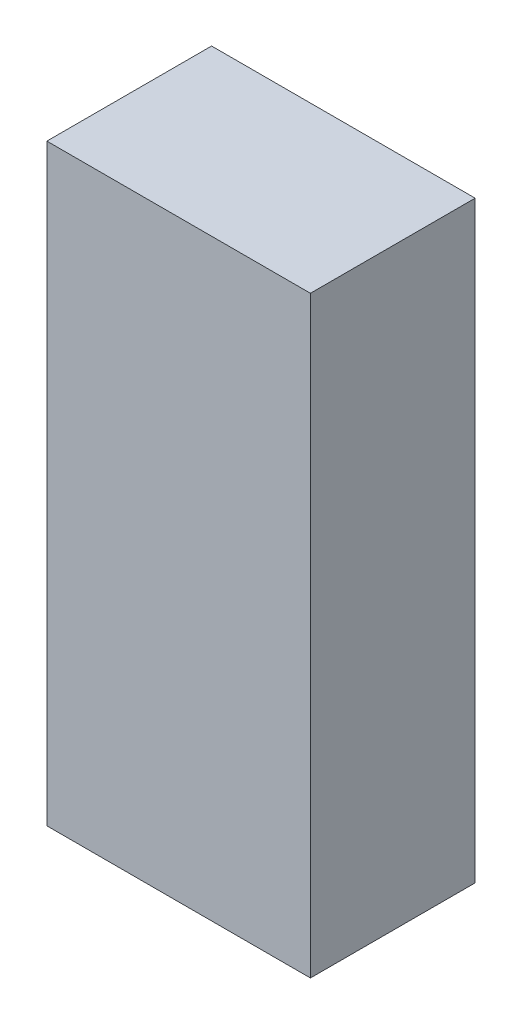
ISO-10303-21;
HEADER;
FILE_DESCRIPTION(('STEP AP214'),'2;1');
FILE_NAME('part.step','',(''),(''),'','','');
FILE_SCHEMA(('AUTOMOTIVE_DESIGN { 1 0 10303 214 1 1 1 1 }'));
ENDSEC;
DATA;
#1=APPLICATION_CONTEXT('core data for automotive mechanical design processes');
#2=APPLICATION_PROTOCOL_DEFINITION('international standard','automotive_design',2000,#1);
#3=PRODUCT_CONTEXT('',#1,'mechanical');
#4=PRODUCT('Part','Part','',(#3));
#5=PRODUCT_RELATED_PRODUCT_CATEGORY('part','',(#4));
#6=PRODUCT_DEFINITION_FORMATION('','',#4);
#7=PRODUCT_DEFINITION_CONTEXT('part definition',#1,'design');
#8=PRODUCT_DEFINITION('design','',#6,#7);
#9=PRODUCT_DEFINITION_SHAPE('','',#8);
#10=(LENGTH_UNIT() NAMED_UNIT(*) SI_UNIT(.MILLI.,.METRE.));
#11=(NAMED_UNIT(*) PLANE_ANGLE_UNIT() SI_UNIT($,.RADIAN.));
#12=(NAMED_UNIT(*) SI_UNIT($,.STERADIAN.) SOLID_ANGLE_UNIT());
#13=UNCERTAINTY_MEASURE_WITH_UNIT(LENGTH_MEASURE(1.E-05),#10,'distance_accuracy_value','');
#14=(GEOMETRIC_REPRESENTATION_CONTEXT(3) GLOBAL_UNCERTAINTY_ASSIGNED_CONTEXT((#13)) GLOBAL_UNIT_ASSIGNED_CONTEXT((#10,
#11,#12)) REPRESENTATION_CONTEXT('',''));
#15=CARTESIAN_POINT('',(0.,0.,0.));
#16=DIRECTION('',(0.,0.,1.));
#17=DIRECTION('',(1.,0.,0.));
#18=AXIS2_PLACEMENT_3D('',#15,#16,#17);
#19=CARTESIAN_POINT('',(12.7,57.15,7.9375));
#20=DIRECTION('',(-1.,0.,0.));
#21=DIRECTION('',(0.,0.,1.));
#22=AXIS2_PLACEMENT_3D('',#19,#20,#21);
#23=PLANE('',#22);
#24=DIRECTION('',(0.,0.,-1.));
#25=VECTOR('',#24,1.);
#26=CARTESIAN_POINT('',(12.7,0.,7.9375));
#27=LINE('',#26,#25);
#28=CARTESIAN_POINT('',(12.7,0.,7.9375));
#29=VERTEX_POINT('',#28);
#30=CARTESIAN_POINT('',(12.7,0.,-7.9375));
#31=VERTEX_POINT('',#30);
#32=EDGE_CURVE('E97',#29,#31,#27,.T.);
#33=ORIENTED_EDGE('',*,*,#32,.T.);
#34=DIRECTION('',(0.,-1.,0.));
#35=VECTOR('',#34,1.);
#36=CARTESIAN_POINT('',(12.7,57.15,-7.9375));
#37=LINE('',#36,#35);
#38=CARTESIAN_POINT('',(12.7,57.15,-7.9375));
#39=VERTEX_POINT('',#38);
#40=EDGE_CURVE('E11',#39,#31,#37,.T.);
#41=ORIENTED_EDGE('',*,*,#40,.F.);
#42=DIRECTION('',(0.,0.,-1.));
#43=VECTOR('',#42,1.);
#44=CARTESIAN_POINT('',(12.7,57.15,7.9375));
#45=LINE('',#44,#43);
#46=CARTESIAN_POINT('',(12.7,57.15,7.9375));
#47=VERTEX_POINT('',#46);
#48=EDGE_CURVE('E85',#47,#39,#45,.T.);
#49=ORIENTED_EDGE('',*,*,#48,.F.);
#50=DIRECTION('',(0.,-1.,0.));
#51=VECTOR('',#50,1.);
#52=CARTESIAN_POINT('',(12.7,57.15,7.9375));
#53=LINE('',#52,#51);
#54=EDGE_CURVE('E93',#47,#29,#53,.T.);
#55=ORIENTED_EDGE('',*,*,#54,.T.);
#56=EDGE_LOOP('',(#33,#41,#49,#55));
#57=FACE_BOUND('',#56,.T.);
#58=ADVANCED_FACE('F34',(#57),#23,.F.);
#59=CARTESIAN_POINT('',(-12.7,57.15,-7.9375));
#60=DIRECTION('',(0.,0.,1.));
#61=DIRECTION('',(1.,0.,0.));
#62=AXIS2_PLACEMENT_3D('',#59,#60,#61);
#63=PLANE('',#62);
#64=DIRECTION('',(-1.,0.,0.));
#65=VECTOR('',#64,1.);
#66=CARTESIAN_POINT('',(-12.7,0.,-7.9375));
#67=LINE('',#66,#65);
#68=CARTESIAN_POINT('',(-12.7,0.,-7.9375));
#69=VERTEX_POINT('',#68);
#70=EDGE_CURVE('E89',#31,#69,#67,.T.);
#71=ORIENTED_EDGE('',*,*,#70,.T.);
#72=DIRECTION('',(0.,-1.,0.));
#73=VECTOR('',#72,1.);
#74=CARTESIAN_POINT('',(-12.7,57.15,-7.9375));
#75=LINE('',#74,#73);
#76=CARTESIAN_POINT('',(-12.7,57.15,-7.9375));
#77=VERTEX_POINT('',#76);
#78=EDGE_CURVE('E42',#77,#69,#75,.T.);
#79=ORIENTED_EDGE('',*,*,#78,.F.);
#80=DIRECTION('',(-1.,0.,0.));
#81=VECTOR('',#80,1.);
#82=CARTESIAN_POINT('',(-12.7,57.15,-7.9375));
#83=LINE('',#82,#81);
#84=EDGE_CURVE('E80',#39,#77,#83,.T.);
#85=ORIENTED_EDGE('',*,*,#84,.F.);
#86=ORIENTED_EDGE('',*,*,#40,.T.);
#87=EDGE_LOOP('',(#71,#79,#85,#86));
#88=FACE_BOUND('',#87,.T.);
#89=ADVANCED_FACE('F88',(#88),#63,.F.);
#90=CARTESIAN_POINT('',(-12.7,57.15,7.9375));
#91=DIRECTION('',(1.,0.,0.));
#92=DIRECTION('',(0.,0.,-1.));
#93=AXIS2_PLACEMENT_3D('',#90,#91,#92);
#94=PLANE('',#93);
#95=DIRECTION('',(0.,0.,1.));
#96=VECTOR('',#95,1.);
#97=CARTESIAN_POINT('',(-12.7,0.,7.9375));
#98=LINE('',#97,#96);
#99=CARTESIAN_POINT('',(-12.7,0.,7.9375));
#100=VERTEX_POINT('',#99);
#101=EDGE_CURVE('E67',#69,#100,#98,.T.);
#102=ORIENTED_EDGE('',*,*,#101,.T.);
#103=DIRECTION('',(0.,-1.,0.));
#104=VECTOR('',#103,1.);
#105=CARTESIAN_POINT('',(-12.7,57.15,7.9375));
#106=LINE('',#105,#104);
#107=CARTESIAN_POINT('',(-12.7,57.15,7.9375));
#108=VERTEX_POINT('',#107);
#109=EDGE_CURVE('E90',#108,#100,#106,.T.);
#110=ORIENTED_EDGE('',*,*,#109,.F.);
#111=DIRECTION('',(0.,0.,1.));
#112=VECTOR('',#111,1.);
#113=CARTESIAN_POINT('',(-12.7,57.15,7.9375));
#114=LINE('',#113,#112);
#115=EDGE_CURVE('E83',#77,#108,#114,.T.);
#116=ORIENTED_EDGE('',*,*,#115,.F.);
#117=ORIENTED_EDGE('',*,*,#78,.T.);
#118=EDGE_LOOP('',(#102,#110,#116,#117));
#119=FACE_BOUND('',#118,.T.);
#120=ADVANCED_FACE('F91',(#119),#94,.F.);
#121=CARTESIAN_POINT('',(-12.7,57.15,7.9375));
#122=DIRECTION('',(0.,0.,-1.));
#123=DIRECTION('',(-1.,0.,0.));
#124=AXIS2_PLACEMENT_3D('',#121,#122,#123);
#125=PLANE('',#124);
#126=DIRECTION('',(1.,0.,0.));
#127=VECTOR('',#126,1.);
#128=CARTESIAN_POINT('',(-12.7,0.,7.9375));
#129=LINE('',#128,#127);
#130=EDGE_CURVE('E73',#100,#29,#129,.T.);
#131=ORIENTED_EDGE('',*,*,#130,.T.);
#132=ORIENTED_EDGE('',*,*,#54,.F.);
#133=DIRECTION('',(1.,0.,0.));
#134=VECTOR('',#133,1.);
#135=CARTESIAN_POINT('',(-12.7,57.15,7.9375));
#136=LINE('',#135,#134);
#137=EDGE_CURVE('E50',#108,#47,#136,.T.);
#138=ORIENTED_EDGE('',*,*,#137,.F.);
#139=ORIENTED_EDGE('',*,*,#109,.T.);
#140=EDGE_LOOP('',(#131,#132,#138,#139));
#141=FACE_BOUND('',#140,.T.);
#142=ADVANCED_FACE('F104',(#141),#125,.F.);
#143=CARTESIAN_POINT('',(0.,57.15,0.));
#144=DIRECTION('',(0.,-1.,0.));
#145=DIRECTION('',(0.,0.,-1.));
#146=AXIS2_PLACEMENT_3D('',#143,#144,#145);
#147=PLANE('',#146);
#148=ORIENTED_EDGE('',*,*,#48,.T.);
#149=ORIENTED_EDGE('',*,*,#84,.T.);
#150=ORIENTED_EDGE('',*,*,#115,.T.);
#151=ORIENTED_EDGE('',*,*,#137,.T.);
#152=EDGE_LOOP('',(#148,#149,#150,#151));
#153=FACE_BOUND('',#152,.T.);
#154=ADVANCED_FACE('F81',(#153),#147,.F.);
#155=CARTESIAN_POINT('',(0.,0.,0.));
#156=DIRECTION('',(0.,-1.,0.));
#157=DIRECTION('',(0.,0.,-1.));
#158=AXIS2_PLACEMENT_3D('',#155,#156,#157);
#159=PLANE('',#158);
#160=ORIENTED_EDGE('',*,*,#32,.F.);
#161=ORIENTED_EDGE('',*,*,#130,.F.);
#162=ORIENTED_EDGE('',*,*,#101,.F.);
#163=ORIENTED_EDGE('',*,*,#70,.F.);
#164=EDGE_LOOP('',(#160,#161,#162,#163));
#165=FACE_BOUND('',#164,.T.);
#166=ADVANCED_FACE('F107',(#165),#159,.T.);
#167=CLOSED_SHELL('',(#58,#89,#120,#142,#154,#166));
#168=MANIFOLD_SOLID_BREP('B2',#167);
#169=ADVANCED_BREP_SHAPE_REPRESENTATION('',(#18,#168),#14);
#170=SHAPE_DEFINITION_REPRESENTATION(#9,#169);
ENDSEC;
END-ISO-10303-21;
